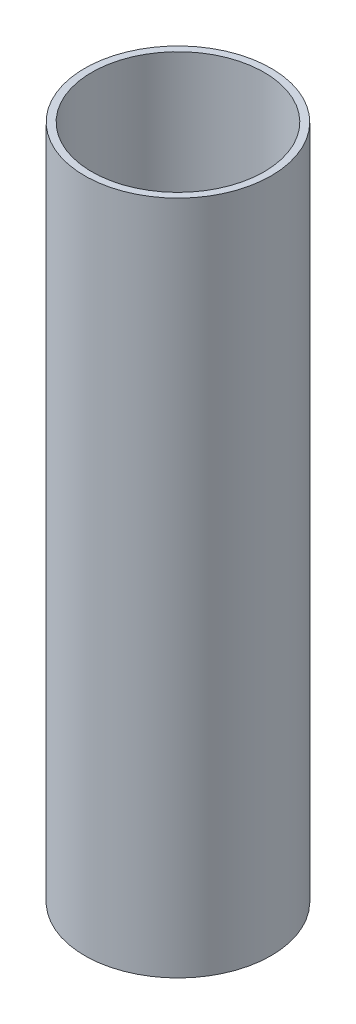
ISO-10303-21;
HEADER;
FILE_DESCRIPTION(('STEP AP214'),'2;1');
FILE_NAME('part.step','',(''),(''),'','','');
FILE_SCHEMA(('AUTOMOTIVE_DESIGN { 1 0 10303 214 1 1 1 1 }'));
ENDSEC;
DATA;
#1=APPLICATION_CONTEXT('core data for automotive mechanical design processes');
#2=APPLICATION_PROTOCOL_DEFINITION('international standard','automotive_design',2000,#1);
#3=PRODUCT_CONTEXT('',#1,'mechanical');
#4=PRODUCT('Part','Part','',(#3));
#5=PRODUCT_RELATED_PRODUCT_CATEGORY('part','',(#4));
#6=PRODUCT_DEFINITION_FORMATION('','',#4);
#7=PRODUCT_DEFINITION_CONTEXT('part definition',#1,'design');
#8=PRODUCT_DEFINITION('design','',#6,#7);
#9=PRODUCT_DEFINITION_SHAPE('','',#8);
#10=(LENGTH_UNIT() NAMED_UNIT(*) SI_UNIT(.MILLI.,.METRE.));
#11=(NAMED_UNIT(*) PLANE_ANGLE_UNIT() SI_UNIT($,.RADIAN.));
#12=(NAMED_UNIT(*) SI_UNIT($,.STERADIAN.) SOLID_ANGLE_UNIT());
#13=UNCERTAINTY_MEASURE_WITH_UNIT(LENGTH_MEASURE(1.E-05),#10,'distance_accuracy_value','');
#14=(GEOMETRIC_REPRESENTATION_CONTEXT(3) GLOBAL_UNCERTAINTY_ASSIGNED_CONTEXT((#13)) GLOBAL_UNIT_ASSIGNED_CONTEXT((#10,
#11,#12)) REPRESENTATION_CONTEXT('',''));
#15=CARTESIAN_POINT('',(0.,0.,0.));
#16=DIRECTION('',(0.,0.,1.));
#17=DIRECTION('',(1.,0.,0.));
#18=AXIS2_PLACEMENT_3D('',#15,#16,#17);
#19=CARTESIAN_POINT('',(0.,0.,0.));
#20=DIRECTION('',(0.,-1.,0.));
#21=DIRECTION('',(1.,0.,0.));
#22=AXIS2_PLACEMENT_3D('',#19,#20,#21);
#23=CYLINDRICAL_SURFACE('',#22,77.7875000000002);
#24=CARTESIAN_POINT('',(-1.52172573955198E-13,2844.8,0.));
#25=DIRECTION('',(0.,-1.,0.));
#26=DIRECTION('',(1.,0.,0.));
#27=AXIS2_PLACEMENT_3D('',#24,#25,#26);
#28=CIRCLE('',#27,77.7875000000002);
#29=CARTESIAN_POINT('',(77.7875000000001,2844.8,0.));
#30=VERTEX_POINT('',#29);
#31=EDGE_CURVE('E45',#30,#30,#28,.T.);
#32=ORIENTED_EDGE('',*,*,#31,.T.);
#33=EDGE_LOOP('',(#32));
#34=FACE_BOUND('',#33,.T.);
#35=CARTESIAN_POINT('',(-1.84780982659883E-13,3454.4,0.));
#36=DIRECTION('',(0.,-1.,0.));
#37=DIRECTION('',(1.,0.,0.));
#38=AXIS2_PLACEMENT_3D('',#35,#36,#37);
#39=CIRCLE('',#38,77.7875000000002);
#40=CARTESIAN_POINT('',(77.7875000000001,3454.4,0.));
#41=VERTEX_POINT('',#40);
#42=EDGE_CURVE('E10',#41,#41,#39,.T.);
#43=ORIENTED_EDGE('',*,*,#42,.F.);
#44=EDGE_LOOP('',(#43));
#45=FACE_BOUND('',#44,.T.);
#46=ADVANCED_FACE('F31',(#34,#45),#23,.F.);
#47=CARTESIAN_POINT('',(77.7875000000001,3454.4,0.));
#48=DIRECTION('',(0.,1.,0.));
#49=DIRECTION('',(-1.,0.,0.));
#50=AXIS2_PLACEMENT_3D('',#47,#48,#49);
#51=PLANE('',#50);
#52=ORIENTED_EDGE('',*,*,#42,.T.);
#53=EDGE_LOOP('',(#52));
#54=FACE_BOUND('',#53,.T.);
#55=CARTESIAN_POINT('',(-1.84780982659883E-13,3454.4,0.));
#56=DIRECTION('',(0.,-1.,0.));
#57=DIRECTION('',(1.,0.,0.));
#58=AXIS2_PLACEMENT_3D('',#55,#56,#57);
#59=CIRCLE('',#58,84.1375000000002);
#60=CARTESIAN_POINT('',(84.1375,3454.4,0.));
#61=VERTEX_POINT('',#60);
#62=EDGE_CURVE('E37',#61,#61,#59,.T.);
#63=ORIENTED_EDGE('',*,*,#62,.F.);
#64=EDGE_LOOP('',(#63));
#65=FACE_BOUND('',#64,.T.);
#66=ADVANCED_FACE('F61',(#54,#65),#51,.T.);
#67=CARTESIAN_POINT('',(0.,0.,0.));
#68=DIRECTION('',(0.,-1.,0.));
#69=DIRECTION('',(1.,0.,0.));
#70=AXIS2_PLACEMENT_3D('',#67,#68,#69);
#71=CYLINDRICAL_SURFACE('',#70,84.1375000000002);
#72=ORIENTED_EDGE('',*,*,#62,.T.);
#73=EDGE_LOOP('',(#72));
#74=FACE_BOUND('',#73,.T.);
#75=CARTESIAN_POINT('',(-1.52172573955198E-13,2844.8,0.));
#76=DIRECTION('',(0.,-1.,0.));
#77=DIRECTION('',(1.,0.,0.));
#78=AXIS2_PLACEMENT_3D('',#75,#76,#77);
#79=CIRCLE('',#78,84.1375000000002);
#80=CARTESIAN_POINT('',(84.1375,2844.8,0.));
#81=VERTEX_POINT('',#80);
#82=EDGE_CURVE('E41',#81,#81,#79,.T.);
#83=ORIENTED_EDGE('',*,*,#82,.F.);
#84=EDGE_LOOP('',(#83));
#85=FACE_BOUND('',#84,.T.);
#86=ADVANCED_FACE('F55',(#74,#85),#71,.T.);
#87=CARTESIAN_POINT('',(77.7875000000001,2844.8,0.));
#88=DIRECTION('',(0.,-1.,0.));
#89=DIRECTION('',(1.,0.,0.));
#90=AXIS2_PLACEMENT_3D('',#87,#88,#89);
#91=PLANE('',#90);
#92=ORIENTED_EDGE('',*,*,#82,.T.);
#93=EDGE_LOOP('',(#92));
#94=FACE_BOUND('',#93,.T.);
#95=ORIENTED_EDGE('',*,*,#31,.F.);
#96=EDGE_LOOP('',(#95));
#97=FACE_BOUND('',#96,.T.);
#98=ADVANCED_FACE('F53',(#94,#97),#91,.T.);
#99=CLOSED_SHELL('',(#46,#66,#86,#98));
#100=MANIFOLD_SOLID_BREP('B2',#99);
#101=ADVANCED_BREP_SHAPE_REPRESENTATION('',(#18,#100),#14);
#102=SHAPE_DEFINITION_REPRESENTATION(#9,#101);
ENDSEC;
END-ISO-10303-21;
